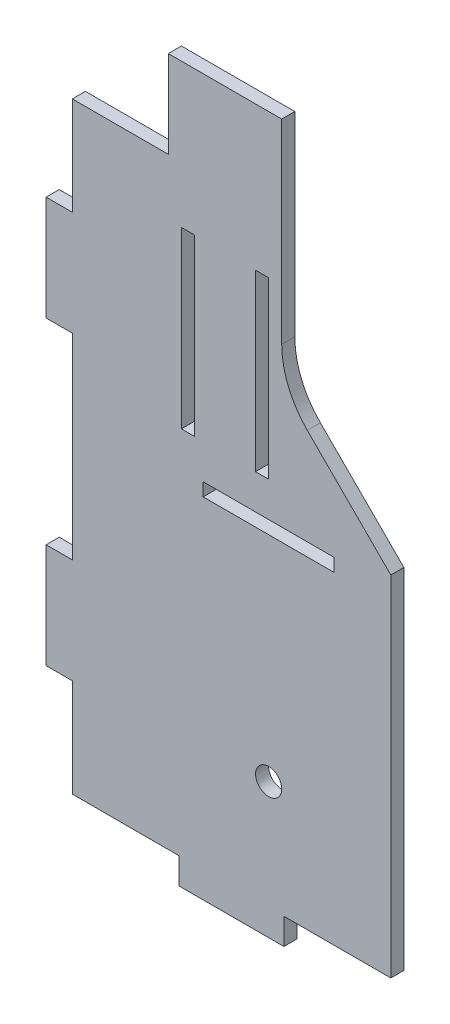
ISO-10303-21;
HEADER;
FILE_DESCRIPTION(('STEP AP214'),'2;1');
FILE_NAME('part.step','',(''),(''),'','','');
FILE_SCHEMA(('AUTOMOTIVE_DESIGN { 1 0 10303 214 1 1 1 1 }'));
ENDSEC;
DATA;
#1=APPLICATION_CONTEXT('core data for automotive mechanical design processes');
#2=APPLICATION_PROTOCOL_DEFINITION('international standard','automotive_design',2000,#1);
#3=PRODUCT_CONTEXT('',#1,'mechanical');
#4=PRODUCT('Part','Part','',(#3));
#5=PRODUCT_RELATED_PRODUCT_CATEGORY('part','',(#4));
#6=PRODUCT_DEFINITION_FORMATION('','',#4);
#7=PRODUCT_DEFINITION_CONTEXT('part definition',#1,'design');
#8=PRODUCT_DEFINITION('design','',#6,#7);
#9=PRODUCT_DEFINITION_SHAPE('','',#8);
#10=(LENGTH_UNIT() NAMED_UNIT(*) SI_UNIT(.MILLI.,.METRE.));
#11=(NAMED_UNIT(*) PLANE_ANGLE_UNIT() SI_UNIT($,.RADIAN.));
#12=(NAMED_UNIT(*) SI_UNIT($,.STERADIAN.) SOLID_ANGLE_UNIT());
#13=UNCERTAINTY_MEASURE_WITH_UNIT(LENGTH_MEASURE(1.E-05),#10,'distance_accuracy_value','');
#14=(GEOMETRIC_REPRESENTATION_CONTEXT(3) GLOBAL_UNCERTAINTY_ASSIGNED_CONTEXT((#13)) GLOBAL_UNIT_ASSIGNED_CONTEXT((#10,
#11,#12)) REPRESENTATION_CONTEXT('',''));
#15=CARTESIAN_POINT('',(0.,0.,0.));
#16=DIRECTION('',(0.,0.,1.));
#17=DIRECTION('',(1.,0.,0.));
#18=AXIS2_PLACEMENT_3D('',#15,#16,#17);
#19=CARTESIAN_POINT('',(-31.,138.,3.));
#20=DIRECTION('',(0.,-1.,0.));
#21=DIRECTION('',(0.,0.,-1.));
#22=AXIS2_PLACEMENT_3D('',#19,#20,#21);
#23=PLANE('',#22);
#24=DIRECTION('',(0.,0.,1.));
#25=VECTOR('',#24,1.);
#26=CARTESIAN_POINT('',(-51.,138.,0.));
#27=LINE('',#26,#25);
#28=CARTESIAN_POINT('',(-51.,138.,0.));
#29=VERTEX_POINT('',#28);
#30=CARTESIAN_POINT('',(-51.,138.,3.));
#31=VERTEX_POINT('',#30);
#32=EDGE_CURVE('E50',#29,#31,#27,.T.);
#33=ORIENTED_EDGE('',*,*,#32,.F.);
#34=DIRECTION('',(-1.,0.,0.));
#35=VECTOR('',#34,1.);
#36=CARTESIAN_POINT('',(-31.,138.,0.));
#37=LINE('',#36,#35);
#38=CARTESIAN_POINT('',(-73.,138.,0.));
#39=VERTEX_POINT('',#38);
#40=EDGE_CURVE('E463',#29,#39,#37,.T.);
#41=ORIENTED_EDGE('',*,*,#40,.T.);
#42=DIRECTION('',(0.,0.,-1.));
#43=VECTOR('',#42,1.);
#44=CARTESIAN_POINT('',(-73.,138.,3.));
#45=LINE('',#44,#43);
#46=CARTESIAN_POINT('',(-73.,138.,3.));
#47=VERTEX_POINT('',#46);
#48=EDGE_CURVE('E497',#47,#39,#45,.T.);
#49=ORIENTED_EDGE('',*,*,#48,.F.);
#50=DIRECTION('',(-1.,0.,0.));
#51=VECTOR('',#50,1.);
#52=CARTESIAN_POINT('',(-31.,138.,3.));
#53=LINE('',#52,#51);
#54=EDGE_CURVE('E466',#31,#47,#53,.T.);
#55=ORIENTED_EDGE('',*,*,#54,.F.);
#56=EDGE_LOOP('',(#33,#41,#49,#55));
#57=FACE_BOUND('',#56,.T.);
#58=ADVANCED_FACE('F35',(#57),#23,.F.);
#59=CARTESIAN_POINT('',(-73.,0.,3.));
#60=DIRECTION('',(0.,1.,0.));
#61=DIRECTION('',(-1.,0.,0.));
#62=AXIS2_PLACEMENT_3D('',#59,#60,#61);
#63=PLANE('',#62);
#64=DIRECTION('',(0.,0.,1.));
#65=VECTOR('',#64,1.);
#66=CARTESIAN_POINT('',(-24.5,0.,-68.425141578224));
#67=LINE('',#66,#65);
#68=CARTESIAN_POINT('',(-24.5,0.,0.));
#69=VERTEX_POINT('',#68);
#70=CARTESIAN_POINT('',(-24.5,0.,3.));
#71=VERTEX_POINT('',#70);
#72=EDGE_CURVE('E399',#69,#71,#67,.T.);
#73=ORIENTED_EDGE('',*,*,#72,.F.);
#74=DIRECTION('',(1.,0.,0.));
#75=VECTOR('',#74,1.);
#76=CARTESIAN_POINT('',(-73.,0.,0.));
#77=LINE('',#76,#75);
#78=CARTESIAN_POINT('',(0.,0.,0.));
#79=VERTEX_POINT('',#78);
#80=EDGE_CURVE('E486',#69,#79,#77,.T.);
#81=ORIENTED_EDGE('',*,*,#80,.T.);
#82=DIRECTION('',(0.,0.,-1.));
#83=VECTOR('',#82,1.);
#84=CARTESIAN_POINT('',(0.,0.,3.));
#85=LINE('',#84,#83);
#86=CARTESIAN_POINT('',(0.,0.,3.));
#87=VERTEX_POINT('',#86);
#88=EDGE_CURVE('E481',#87,#79,#85,.T.);
#89=ORIENTED_EDGE('',*,*,#88,.F.);
#90=DIRECTION('',(1.,0.,0.));
#91=VECTOR('',#90,1.);
#92=CARTESIAN_POINT('',(-73.,0.,3.));
#93=LINE('',#92,#91);
#94=EDGE_CURVE('E473',#71,#87,#93,.T.);
#95=ORIENTED_EDGE('',*,*,#94,.F.);
#96=EDGE_LOOP('',(#73,#81,#89,#95));
#97=FACE_BOUND('',#96,.T.);
#98=ADVANCED_FACE('F592',(#97),#63,.F.);
#99=CARTESIAN_POINT('',(-73.,138.,3.));
#100=DIRECTION('',(1.,0.,0.));
#101=DIRECTION('',(0.,1.,0.));
#102=AXIS2_PLACEMENT_3D('',#99,#100,#101);
#103=PLANE('',#102);
#104=DIRECTION('',(0.,-1.,0.));
#105=VECTOR('',#104,1.);
#106=CARTESIAN_POINT('',(-73.,138.,3.));
#107=LINE('',#106,#105);
#108=CARTESIAN_POINT('',(-73.,22.5,3.));
#109=VERTEX_POINT('',#108);
#110=CARTESIAN_POINT('',(-73.,0.,3.));
#111=VERTEX_POINT('',#110);
#112=EDGE_CURVE('E468',#109,#111,#107,.T.);
#113=ORIENTED_EDGE('',*,*,#112,.F.);
#114=DIRECTION('',(0.,0.,1.));
#115=VECTOR('',#114,1.);
#116=CARTESIAN_POINT('',(-73.,22.5,-68.425141578224));
#117=LINE('',#116,#115);
#118=CARTESIAN_POINT('',(-73.,22.5,0.));
#119=VERTEX_POINT('',#118);
#120=EDGE_CURVE('E410',#119,#109,#117,.T.);
#121=ORIENTED_EDGE('',*,*,#120,.F.);
#122=DIRECTION('',(0.,-1.,0.));
#123=VECTOR('',#122,1.);
#124=CARTESIAN_POINT('',(-73.,138.,0.));
#125=LINE('',#124,#123);
#126=CARTESIAN_POINT('',(-73.,0.,0.));
#127=VERTEX_POINT('',#126);
#128=EDGE_CURVE('E483',#119,#127,#125,.T.);
#129=ORIENTED_EDGE('',*,*,#128,.T.);
#130=DIRECTION('',(0.,0.,-1.));
#131=VECTOR('',#130,1.);
#132=CARTESIAN_POINT('',(-73.,0.,3.));
#133=LINE('',#132,#131);
#134=EDGE_CURVE('E494',#111,#127,#133,.T.);
#135=ORIENTED_EDGE('',*,*,#134,.F.);
#136=EDGE_LOOP('',(#113,#121,#129,#135));
#137=FACE_BOUND('',#136,.T.);
#138=ADVANCED_FACE('F541',(#137),#103,.F.);
#139=CARTESIAN_POINT('',(-73.,91.5,0.));
#140=VERTEX_POINT('',#139);
#141=CARTESIAN_POINT('',(-73.,46.5,0.));
#142=VERTEX_POINT('',#141);
#143=EDGE_CURVE('E487',#140,#142,#125,.T.);
#144=ORIENTED_EDGE('',*,*,#143,.T.);
#145=DIRECTION('',(0.,0.,1.));
#146=VECTOR('',#145,1.);
#147=CARTESIAN_POINT('',(-73.,46.5,-68.425141578224));
#148=LINE('',#147,#146);
#149=CARTESIAN_POINT('',(-73.,46.5,3.));
#150=VERTEX_POINT('',#149);
#151=EDGE_CURVE('E421',#142,#150,#148,.T.);
#152=ORIENTED_EDGE('',*,*,#151,.T.);
#153=CARTESIAN_POINT('',(-73.,91.5,3.));
#154=VERTEX_POINT('',#153);
#155=EDGE_CURVE('E474',#154,#150,#107,.T.);
#156=ORIENTED_EDGE('',*,*,#155,.F.);
#157=DIRECTION('',(0.,0.,1.));
#158=VECTOR('',#157,1.);
#159=CARTESIAN_POINT('',(-73.,91.5,-68.425141578224));
#160=LINE('',#159,#158);
#161=EDGE_CURVE('E435',#140,#154,#160,.T.);
#162=ORIENTED_EDGE('',*,*,#161,.F.);
#163=EDGE_LOOP('',(#144,#152,#156,#162));
#164=FACE_BOUND('',#163,.T.);
#165=ADVANCED_FACE('F686',(#164),#103,.F.);
#166=CARTESIAN_POINT('',(-73.,115.5,0.));
#167=VERTEX_POINT('',#166);
#168=EDGE_CURVE('E484',#39,#167,#125,.T.);
#169=ORIENTED_EDGE('',*,*,#168,.T.);
#170=DIRECTION('',(0.,0.,1.));
#171=VECTOR('',#170,1.);
#172=CARTESIAN_POINT('',(-73.,115.5,-68.425141578224));
#173=LINE('',#172,#171);
#174=CARTESIAN_POINT('',(-73.,115.5,3.));
#175=VERTEX_POINT('',#174);
#176=EDGE_CURVE('E446',#167,#175,#173,.T.);
#177=ORIENTED_EDGE('',*,*,#176,.T.);
#178=EDGE_CURVE('E470',#47,#175,#107,.T.);
#179=ORIENTED_EDGE('',*,*,#178,.F.);
#180=ORIENTED_EDGE('',*,*,#48,.T.);
#181=EDGE_LOOP('',(#169,#177,#179,#180));
#182=FACE_BOUND('',#181,.T.);
#183=ADVANCED_FACE('F578',(#182),#103,.F.);
#184=CARTESIAN_POINT('',(-48.5,0.,0.));
#185=VERTEX_POINT('',#184);
#186=EDGE_CURVE('E488',#127,#185,#77,.T.);
#187=ORIENTED_EDGE('',*,*,#186,.T.);
#188=DIRECTION('',(0.,0.,1.));
#189=VECTOR('',#188,1.);
#190=CARTESIAN_POINT('',(-48.5,0.,-68.425141578224));
#191=LINE('',#190,#189);
#192=CARTESIAN_POINT('',(-48.5,0.,3.));
#193=VERTEX_POINT('',#192);
#194=EDGE_CURVE('E385',#185,#193,#191,.T.);
#195=ORIENTED_EDGE('',*,*,#194,.T.);
#196=EDGE_CURVE('E475',#111,#193,#93,.T.);
#197=ORIENTED_EDGE('',*,*,#196,.F.);
#198=ORIENTED_EDGE('',*,*,#134,.T.);
#199=EDGE_LOOP('',(#187,#195,#197,#198));
#200=FACE_BOUND('',#199,.T.);
#201=ADVANCED_FACE('F536',(#200),#63,.F.);
#202=CARTESIAN_POINT('',(0.,0.,3.));
#203=DIRECTION('',(-1.,0.,0.));
#204=DIRECTION('',(0.,-1.,0.));
#205=AXIS2_PLACEMENT_3D('',#202,#203,#204);
#206=PLANE('',#205);
#207=DIRECTION('',(0.,1.,0.));
#208=VECTOR('',#207,1.);
#209=CARTESIAN_POINT('',(0.,0.,0.));
#210=LINE('',#209,#208);
#211=CARTESIAN_POINT('',(0.,80.,0.));
#212=VERTEX_POINT('',#211);
#213=EDGE_CURVE('E469',#79,#212,#210,.T.);
#214=ORIENTED_EDGE('',*,*,#213,.T.);
#215=DIRECTION('',(0.,0.,1.));
#216=VECTOR('',#215,1.);
#217=CARTESIAN_POINT('',(0.,80.,-68.425141578224));
#218=LINE('',#217,#216);
#219=CARTESIAN_POINT('',(0.,80.,3.));
#220=VERTEX_POINT('',#219);
#221=EDGE_CURVE('E261',#212,#220,#218,.T.);
#222=ORIENTED_EDGE('',*,*,#221,.T.);
#223=DIRECTION('',(0.,1.,0.));
#224=VECTOR('',#223,1.);
#225=CARTESIAN_POINT('',(0.,0.,3.));
#226=LINE('',#225,#224);
#227=EDGE_CURVE('E478',#87,#220,#226,.T.);
#228=ORIENTED_EDGE('',*,*,#227,.F.);
#229=ORIENTED_EDGE('',*,*,#88,.T.);
#230=EDGE_LOOP('',(#214,#222,#228,#229));
#231=FACE_BOUND('',#230,.T.);
#232=ADVANCED_FACE('F515',(#231),#206,.F.);
#233=CARTESIAN_POINT('',(0.,0.,3.));
#234=DIRECTION('',(0.,0.,1.));
#235=DIRECTION('',(1.,0.,0.));
#236=AXIS2_PLACEMENT_3D('',#233,#234,#235);
#237=PLANE('',#236);
#238=DIRECTION('',(0.,-1.,0.));
#239=VECTOR('',#238,1.);
#240=CARTESIAN_POINT('',(-43.,77.,3.));
#241=LINE('',#240,#239);
#242=CARTESIAN_POINT('',(-43.,77.,3.));
#243=VERTEX_POINT('',#242);
#244=CARTESIAN_POINT('',(-43.,74.,3.));
#245=VERTEX_POINT('',#244);
#246=EDGE_CURVE('E300',#243,#245,#241,.T.);
#247=ORIENTED_EDGE('',*,*,#246,.F.);
#248=DIRECTION('',(-1.,0.,0.));
#249=VECTOR('',#248,1.);
#250=CARTESIAN_POINT('',(-43.,77.,3.));
#251=LINE('',#250,#249);
#252=CARTESIAN_POINT('',(-13.,77.,3.));
#253=VERTEX_POINT('',#252);
#254=EDGE_CURVE('E290',#253,#243,#251,.T.);
#255=ORIENTED_EDGE('',*,*,#254,.F.);
#256=DIRECTION('',(0.,1.,0.));
#257=VECTOR('',#256,1.);
#258=CARTESIAN_POINT('',(-13.,77.,3.));
#259=LINE('',#258,#257);
#260=CARTESIAN_POINT('',(-13.,74.,3.));
#261=VERTEX_POINT('',#260);
#262=EDGE_CURVE('E306',#261,#253,#259,.T.);
#263=ORIENTED_EDGE('',*,*,#262,.F.);
#264=DIRECTION('',(1.,0.,0.));
#265=VECTOR('',#264,1.);
#266=CARTESIAN_POINT('',(-43.,74.,3.));
#267=LINE('',#266,#265);
#268=EDGE_CURVE('E302',#245,#261,#267,.T.);
#269=ORIENTED_EDGE('',*,*,#268,.F.);
#270=EDGE_LOOP('',(#247,#255,#263,#269));
#271=FACE_BOUND('',#270,.T.);
#272=DIRECTION('',(0.,-1.,0.));
#273=VECTOR('',#272,1.);
#274=CARTESIAN_POINT('',(-48.,125.,3.));
#275=LINE('',#274,#273);
#276=CARTESIAN_POINT('',(-48.,125.,3.));
#277=VERTEX_POINT('',#276);
#278=CARTESIAN_POINT('',(-48.,85.,3.));
#279=VERTEX_POINT('',#278);
#280=EDGE_CURVE('E334',#277,#279,#275,.T.);
#281=ORIENTED_EDGE('',*,*,#280,.F.);
#282=DIRECTION('',(-1.,0.,0.));
#283=VECTOR('',#282,1.);
#284=CARTESIAN_POINT('',(-48.,125.,3.));
#285=LINE('',#284,#283);
#286=CARTESIAN_POINT('',(-45.,125.,3.));
#287=VERTEX_POINT('',#286);
#288=EDGE_CURVE('E324',#287,#277,#285,.T.);
#289=ORIENTED_EDGE('',*,*,#288,.F.);
#290=DIRECTION('',(0.,1.,0.));
#291=VECTOR('',#290,1.);
#292=CARTESIAN_POINT('',(-45.,125.,3.));
#293=LINE('',#292,#291);
#294=CARTESIAN_POINT('',(-45.,85.,3.));
#295=VERTEX_POINT('',#294);
#296=EDGE_CURVE('E340',#295,#287,#293,.T.);
#297=ORIENTED_EDGE('',*,*,#296,.F.);
#298=DIRECTION('',(1.,0.,0.));
#299=VECTOR('',#298,1.);
#300=CARTESIAN_POINT('',(-48.,85.,3.));
#301=LINE('',#300,#299);
#302=EDGE_CURVE('E336',#279,#295,#301,.T.);
#303=ORIENTED_EDGE('',*,*,#302,.F.);
#304=EDGE_LOOP('',(#281,#289,#297,#303));
#305=FACE_BOUND('',#304,.T.);
#306=DIRECTION('',(0.,-1.,0.));
#307=VECTOR('',#306,1.);
#308=CARTESIAN_POINT('',(-31.,125.,3.));
#309=LINE('',#308,#307);
#310=CARTESIAN_POINT('',(-31.,125.,3.));
#311=VERTEX_POINT('',#310);
#312=CARTESIAN_POINT('',(-31.,85.,3.));
#313=VERTEX_POINT('',#312);
#314=EDGE_CURVE('E285',#311,#313,#309,.T.);
#315=ORIENTED_EDGE('',*,*,#314,.F.);
#316=DIRECTION('',(-1.,0.,0.));
#317=VECTOR('',#316,1.);
#318=CARTESIAN_POINT('',(-31.,125.,3.));
#319=LINE('',#318,#317);
#320=CARTESIAN_POINT('',(-28.,125.,3.));
#321=VERTEX_POINT('',#320);
#322=EDGE_CURVE('E356',#321,#311,#319,.T.);
#323=ORIENTED_EDGE('',*,*,#322,.F.);
#324=DIRECTION('',(0.,1.,0.));
#325=VECTOR('',#324,1.);
#326=CARTESIAN_POINT('',(-28.,125.,3.));
#327=LINE('',#326,#325);
#328=CARTESIAN_POINT('',(-28.,85.,3.));
#329=VERTEX_POINT('',#328);
#330=EDGE_CURVE('E370',#329,#321,#327,.T.);
#331=ORIENTED_EDGE('',*,*,#330,.F.);
#332=DIRECTION('',(1.,0.,0.));
#333=VECTOR('',#332,1.);
#334=CARTESIAN_POINT('',(-31.,85.,3.));
#335=LINE('',#334,#333);
#336=EDGE_CURVE('E367',#313,#329,#335,.T.);
#337=ORIENTED_EDGE('',*,*,#336,.F.);
#338=EDGE_LOOP('',(#315,#323,#331,#337));
#339=FACE_BOUND('',#338,.T.);
#340=CARTESIAN_POINT('',(-28.,25.,3.));
#341=DIRECTION('',(0.,0.,1.));
#342=DIRECTION('',(1.,0.,0.));
#343=AXIS2_PLACEMENT_3D('',#340,#341,#342);
#344=CIRCLE('',#343,2.99999999999999);
#345=CARTESIAN_POINT('',(-25.,25.,3.));
#346=VERTEX_POINT('',#345);
#347=EDGE_CURVE('E260',#346,#346,#344,.T.);
#348=ORIENTED_EDGE('',*,*,#347,.F.);
#349=EDGE_LOOP('',(#348));
#350=FACE_BOUND('',#349,.T.);
#351=DIRECTION('',(0.,1.,0.));
#352=VECTOR('',#351,1.);
#353=CARTESIAN_POINT('',(-25.,138.,3.));
#354=LINE('',#353,#352);
#355=CARTESIAN_POINT('',(-25.,113.284271247462,3.));
#356=VERTEX_POINT('',#355);
#357=CARTESIAN_POINT('',(-25.,158.,3.));
#358=VERTEX_POINT('',#357);
#359=EDGE_CURVE('E455',#356,#358,#354,.T.);
#360=ORIENTED_EDGE('',*,*,#359,.T.);
#361=DIRECTION('',(1.,0.,0.));
#362=VECTOR('',#361,1.);
#363=CARTESIAN_POINT('',(-25.,158.,3.));
#364=LINE('',#363,#362);
#365=CARTESIAN_POINT('',(-51.,158.,3.));
#366=VERTEX_POINT('',#365);
#367=EDGE_CURVE('E275',#366,#358,#364,.T.);
#368=ORIENTED_EDGE('',*,*,#367,.F.);
#369=DIRECTION('',(0.,-1.,0.));
#370=VECTOR('',#369,1.);
#371=CARTESIAN_POINT('',(-51.,158.,3.));
#372=LINE('',#371,#370);
#373=EDGE_CURVE('E280',#366,#31,#372,.T.);
#374=ORIENTED_EDGE('',*,*,#373,.T.);
#375=ORIENTED_EDGE('',*,*,#54,.T.);
#376=ORIENTED_EDGE('',*,*,#178,.T.);
#377=DIRECTION('',(-1.,0.,0.));
#378=VECTOR('',#377,1.);
#379=CARTESIAN_POINT('',(-73.,115.5,3.));
#380=LINE('',#379,#378);
#381=CARTESIAN_POINT('',(-79.,115.5,3.));
#382=VERTEX_POINT('',#381);
#383=EDGE_CURVE('E431',#175,#382,#380,.T.);
#384=ORIENTED_EDGE('',*,*,#383,.T.);
#385=DIRECTION('',(0.,-1.,0.));
#386=VECTOR('',#385,1.);
#387=CARTESIAN_POINT('',(-79.,115.5,3.));
#388=LINE('',#387,#386);
#389=CARTESIAN_POINT('',(-79.,91.5,3.));
#390=VERTEX_POINT('',#389);
#391=EDGE_CURVE('E440',#382,#390,#388,.T.);
#392=ORIENTED_EDGE('',*,*,#391,.T.);
#393=DIRECTION('',(1.,0.,0.));
#394=VECTOR('',#393,1.);
#395=CARTESIAN_POINT('',(-73.,91.5,3.));
#396=LINE('',#395,#394);
#397=EDGE_CURVE('E443',#390,#154,#396,.T.);
#398=ORIENTED_EDGE('',*,*,#397,.T.);
#399=ORIENTED_EDGE('',*,*,#155,.T.);
#400=DIRECTION('',(-1.,0.,0.));
#401=VECTOR('',#400,1.);
#402=CARTESIAN_POINT('',(-73.,46.5,3.));
#403=LINE('',#402,#401);
#404=CARTESIAN_POINT('',(-79.,46.5,3.));
#405=VERTEX_POINT('',#404);
#406=EDGE_CURVE('E406',#150,#405,#403,.T.);
#407=ORIENTED_EDGE('',*,*,#406,.T.);
#408=DIRECTION('',(0.,-1.,0.));
#409=VECTOR('',#408,1.);
#410=CARTESIAN_POINT('',(-79.,46.5,3.));
#411=LINE('',#410,#409);
#412=CARTESIAN_POINT('',(-79.,22.5,3.));
#413=VERTEX_POINT('',#412);
#414=EDGE_CURVE('E415',#405,#413,#411,.T.);
#415=ORIENTED_EDGE('',*,*,#414,.T.);
#416=DIRECTION('',(1.,0.,0.));
#417=VECTOR('',#416,1.);
#418=CARTESIAN_POINT('',(-73.,22.5,3.));
#419=LINE('',#418,#417);
#420=EDGE_CURVE('E418',#413,#109,#419,.T.);
#421=ORIENTED_EDGE('',*,*,#420,.T.);
#422=ORIENTED_EDGE('',*,*,#112,.T.);
#423=ORIENTED_EDGE('',*,*,#196,.T.);
#424=DIRECTION('',(0.,-1.,0.));
#425=VECTOR('',#424,1.);
#426=CARTESIAN_POINT('',(-48.5,0.,3.));
#427=LINE('',#426,#425);
#428=CARTESIAN_POINT('',(-48.5,-6.00000000000003,3.));
#429=VERTEX_POINT('',#428);
#430=EDGE_CURVE('E313',#193,#429,#427,.T.);
#431=ORIENTED_EDGE('',*,*,#430,.T.);
#432=DIRECTION('',(1.,0.,0.));
#433=VECTOR('',#432,1.);
#434=CARTESIAN_POINT('',(-48.5,-6.00000000000003,3.));
#435=LINE('',#434,#433);
#436=CARTESIAN_POINT('',(-24.5,-6.00000000000003,3.));
#437=VERTEX_POINT('',#436);
#438=EDGE_CURVE('E391',#429,#437,#435,.T.);
#439=ORIENTED_EDGE('',*,*,#438,.T.);
#440=DIRECTION('',(0.,1.,0.));
#441=VECTOR('',#440,1.);
#442=CARTESIAN_POINT('',(-24.5,0.,3.));
#443=LINE('',#442,#441);
#444=EDGE_CURVE('E394',#437,#71,#443,.T.);
#445=ORIENTED_EDGE('',*,*,#444,.T.);
#446=ORIENTED_EDGE('',*,*,#94,.T.);
#447=ORIENTED_EDGE('',*,*,#227,.T.);
#448=DIRECTION('',(0.707106781186551,-0.707106781186544,0.));
#449=VECTOR('',#448,1.);
#450=CARTESIAN_POINT('',(1.70002900645727E-13,80.,3.));
#451=LINE('',#450,#449);
#452=CARTESIAN_POINT('',(-19.1421356237309,99.1421356237309,3.));
#453=VERTEX_POINT('',#452);
#454=EDGE_CURVE('E500',#220,#453,#451,.F.);
#455=ORIENTED_EDGE('',*,*,#454,.T.);
#456=CARTESIAN_POINT('',(-5.00000000000002,113.284271247462,3.));
#457=DIRECTION('',(0.,0.,1.));
#458=DIRECTION('',(1.,0.,0.));
#459=AXIS2_PLACEMENT_3D('',#456,#457,#458);
#460=CIRCLE('',#459,20.);
#461=EDGE_CURVE('E11',#453,#356,#460,.F.);
#462=ORIENTED_EDGE('',*,*,#461,.T.);
#463=EDGE_LOOP('',(#360,#368,#374,#375,#376,#384,#392,#398,#399,#407,#415,#421,#422,#423,#431,
#439,#445,#446,#447,#455,#462));
#464=FACE_BOUND('',#463,.T.);
#465=ADVANCED_FACE('F511',(#271,#305,#339,#350,#464),#237,.T.);
#466=CARTESIAN_POINT('',(0.,0.,0.));
#467=DIRECTION('',(0.,0.,1.));
#468=DIRECTION('',(1.,0.,0.));
#469=AXIS2_PLACEMENT_3D('',#466,#467,#468);
#470=PLANE('',#469);
#471=DIRECTION('',(-1.,0.,0.));
#472=VECTOR('',#471,1.);
#473=CARTESIAN_POINT('',(-43.,77.,0.));
#474=LINE('',#473,#472);
#475=CARTESIAN_POINT('',(-13.,77.,0.));
#476=VERTEX_POINT('',#475);
#477=CARTESIAN_POINT('',(-43.,77.,0.));
#478=VERTEX_POINT('',#477);
#479=EDGE_CURVE('E296',#476,#478,#474,.T.);
#480=ORIENTED_EDGE('',*,*,#479,.T.);
#481=DIRECTION('',(0.,-1.,0.));
#482=VECTOR('',#481,1.);
#483=CARTESIAN_POINT('',(-43.,77.,0.));
#484=LINE('',#483,#482);
#485=CARTESIAN_POINT('',(-43.,74.,0.));
#486=VERTEX_POINT('',#485);
#487=EDGE_CURVE('E286',#478,#486,#484,.T.);
#488=ORIENTED_EDGE('',*,*,#487,.T.);
#489=DIRECTION('',(1.,0.,0.));
#490=VECTOR('',#489,1.);
#491=CARTESIAN_POINT('',(-43.,74.,0.));
#492=LINE('',#491,#490);
#493=CARTESIAN_POINT('',(-13.,74.,0.));
#494=VERTEX_POINT('',#493);
#495=EDGE_CURVE('E289',#486,#494,#492,.T.);
#496=ORIENTED_EDGE('',*,*,#495,.T.);
#497=DIRECTION('',(0.,1.,0.));
#498=VECTOR('',#497,1.);
#499=CARTESIAN_POINT('',(-13.,77.,0.));
#500=LINE('',#499,#498);
#501=EDGE_CURVE('E293',#494,#476,#500,.T.);
#502=ORIENTED_EDGE('',*,*,#501,.T.);
#503=EDGE_LOOP('',(#480,#488,#496,#502));
#504=FACE_BOUND('',#503,.T.);
#505=DIRECTION('',(-1.,0.,0.));
#506=VECTOR('',#505,1.);
#507=CARTESIAN_POINT('',(-48.,125.,0.));
#508=LINE('',#507,#506);
#509=CARTESIAN_POINT('',(-45.,125.,0.));
#510=VERTEX_POINT('',#509);
#511=CARTESIAN_POINT('',(-48.,125.,0.));
#512=VERTEX_POINT('',#511);
#513=EDGE_CURVE('E330',#510,#512,#508,.T.);
#514=ORIENTED_EDGE('',*,*,#513,.T.);
#515=DIRECTION('',(0.,-1.,0.));
#516=VECTOR('',#515,1.);
#517=CARTESIAN_POINT('',(-48.,125.,0.));
#518=LINE('',#517,#516);
#519=CARTESIAN_POINT('',(-48.,85.,0.));
#520=VERTEX_POINT('',#519);
#521=EDGE_CURVE('E320',#512,#520,#518,.T.);
#522=ORIENTED_EDGE('',*,*,#521,.T.);
#523=DIRECTION('',(1.,0.,0.));
#524=VECTOR('',#523,1.);
#525=CARTESIAN_POINT('',(-48.,85.,0.));
#526=LINE('',#525,#524);
#527=CARTESIAN_POINT('',(-45.,85.,0.));
#528=VERTEX_POINT('',#527);
#529=EDGE_CURVE('E323',#520,#528,#526,.T.);
#530=ORIENTED_EDGE('',*,*,#529,.T.);
#531=DIRECTION('',(0.,1.,0.));
#532=VECTOR('',#531,1.);
#533=CARTESIAN_POINT('',(-45.,125.,0.));
#534=LINE('',#533,#532);
#535=EDGE_CURVE('E327',#528,#510,#534,.T.);
#536=ORIENTED_EDGE('',*,*,#535,.T.);
#537=EDGE_LOOP('',(#514,#522,#530,#536));
#538=FACE_BOUND('',#537,.T.);
#539=DIRECTION('',(-1.,0.,0.));
#540=VECTOR('',#539,1.);
#541=CARTESIAN_POINT('',(-31.,125.,0.));
#542=LINE('',#541,#540);
#543=CARTESIAN_POINT('',(-28.,125.,0.));
#544=VERTEX_POINT('',#543);
#545=CARTESIAN_POINT('',(-31.,125.,0.));
#546=VERTEX_POINT('',#545);
#547=EDGE_CURVE('E362',#544,#546,#542,.T.);
#548=ORIENTED_EDGE('',*,*,#547,.T.);
#549=DIRECTION('',(0.,-1.,0.));
#550=VECTOR('',#549,1.);
#551=CARTESIAN_POINT('',(-31.,125.,0.));
#552=LINE('',#551,#550);
#553=CARTESIAN_POINT('',(-31.,85.,0.));
#554=VERTEX_POINT('',#553);
#555=EDGE_CURVE('E352',#546,#554,#552,.T.);
#556=ORIENTED_EDGE('',*,*,#555,.T.);
#557=DIRECTION('',(1.,0.,0.));
#558=VECTOR('',#557,1.);
#559=CARTESIAN_POINT('',(-31.,85.,0.));
#560=LINE('',#559,#558);
#561=CARTESIAN_POINT('',(-28.,85.,0.));
#562=VERTEX_POINT('',#561);
#563=EDGE_CURVE('E355',#554,#562,#560,.T.);
#564=ORIENTED_EDGE('',*,*,#563,.T.);
#565=DIRECTION('',(0.,1.,0.));
#566=VECTOR('',#565,1.);
#567=CARTESIAN_POINT('',(-28.,125.,0.));
#568=LINE('',#567,#566);
#569=EDGE_CURVE('E359',#562,#544,#568,.T.);
#570=ORIENTED_EDGE('',*,*,#569,.T.);
#571=EDGE_LOOP('',(#548,#556,#564,#570));
#572=FACE_BOUND('',#571,.T.);
#573=CARTESIAN_POINT('',(-28.,25.,0.));
#574=DIRECTION('',(0.,0.,1.));
#575=DIRECTION('',(1.,0.,0.));
#576=AXIS2_PLACEMENT_3D('',#573,#574,#575);
#577=CIRCLE('',#576,2.99999999999999);
#578=CARTESIAN_POINT('',(-25.,25.,0.));
#579=VERTEX_POINT('',#578);
#580=EDGE_CURVE('E460',#579,#579,#577,.T.);
#581=ORIENTED_EDGE('',*,*,#580,.T.);
#582=EDGE_LOOP('',(#581));
#583=FACE_BOUND('',#582,.T.);
#584=ORIENTED_EDGE('',*,*,#40,.F.);
#585=DIRECTION('',(0.,-1.,0.));
#586=VECTOR('',#585,1.);
#587=CARTESIAN_POINT('',(-51.,158.,0.));
#588=LINE('',#587,#586);
#589=CARTESIAN_POINT('',(-51.,158.,0.));
#590=VERTEX_POINT('',#589);
#591=EDGE_CURVE('E267',#590,#29,#588,.T.);
#592=ORIENTED_EDGE('',*,*,#591,.F.);
#593=DIRECTION('',(-1.,0.,0.));
#594=VECTOR('',#593,1.);
#595=CARTESIAN_POINT('',(-25.,158.,0.));
#596=LINE('',#595,#594);
#597=CARTESIAN_POINT('',(-25.,158.,0.));
#598=VERTEX_POINT('',#597);
#599=EDGE_CURVE('E264',#598,#590,#596,.T.);
#600=ORIENTED_EDGE('',*,*,#599,.F.);
#601=DIRECTION('',(0.,-1.,0.));
#602=VECTOR('',#601,1.);
#603=CARTESIAN_POINT('',(-25.,138.,0.));
#604=LINE('',#603,#602);
#605=CARTESIAN_POINT('',(-25.,113.284271247462,0.));
#606=VERTEX_POINT('',#605);
#607=EDGE_CURVE('E251',#598,#606,#604,.T.);
#608=ORIENTED_EDGE('',*,*,#607,.T.);
#609=CARTESIAN_POINT('',(-5.00000000000002,113.284271247462,0.));
#610=DIRECTION('',(0.,0.,1.));
#611=DIRECTION('',(1.,0.,0.));
#612=AXIS2_PLACEMENT_3D('',#609,#610,#611);
#613=CIRCLE('',#612,20.);
#614=CARTESIAN_POINT('',(-19.1421356237309,99.1421356237309,0.));
#615=VERTEX_POINT('',#614);
#616=EDGE_CURVE('E43',#606,#615,#613,.T.);
#617=ORIENTED_EDGE('',*,*,#616,.T.);
#618=DIRECTION('',(-0.707106781186551,0.707106781186544,0.));
#619=VECTOR('',#618,1.);
#620=CARTESIAN_POINT('',(40.0000000000001,40.0000000000005,0.));
#621=LINE('',#620,#619);
#622=EDGE_CURVE('E502',#615,#212,#621,.F.);
#623=ORIENTED_EDGE('',*,*,#622,.T.);
#624=ORIENTED_EDGE('',*,*,#213,.F.);
#625=ORIENTED_EDGE('',*,*,#80,.F.);
#626=DIRECTION('',(0.,-1.,0.));
#627=VECTOR('',#626,1.);
#628=CARTESIAN_POINT('',(-24.5,0.,0.));
#629=LINE('',#628,#627);
#630=CARTESIAN_POINT('',(-24.5,-6.00000000000003,0.));
#631=VERTEX_POINT('',#630);
#632=EDGE_CURVE('E382',#69,#631,#629,.T.);
#633=ORIENTED_EDGE('',*,*,#632,.T.);
#634=DIRECTION('',(-1.,0.,0.));
#635=VECTOR('',#634,1.);
#636=CARTESIAN_POINT('',(-48.5,-6.00000000000003,0.));
#637=LINE('',#636,#635);
#638=CARTESIAN_POINT('',(-48.5,-6.00000000000003,0.));
#639=VERTEX_POINT('',#638);
#640=EDGE_CURVE('E388',#631,#639,#637,.T.);
#641=ORIENTED_EDGE('',*,*,#640,.T.);
#642=DIRECTION('',(0.,1.,0.));
#643=VECTOR('',#642,1.);
#644=CARTESIAN_POINT('',(-48.5,0.,0.));
#645=LINE('',#644,#643);
#646=EDGE_CURVE('E384',#639,#185,#645,.T.);
#647=ORIENTED_EDGE('',*,*,#646,.T.);
#648=ORIENTED_EDGE('',*,*,#186,.F.);
#649=ORIENTED_EDGE('',*,*,#128,.F.);
#650=DIRECTION('',(-1.,0.,0.));
#651=VECTOR('',#650,1.);
#652=CARTESIAN_POINT('',(-73.,22.5,0.));
#653=LINE('',#652,#651);
#654=CARTESIAN_POINT('',(-79.,22.5,0.));
#655=VERTEX_POINT('',#654);
#656=EDGE_CURVE('E409',#119,#655,#653,.T.);
#657=ORIENTED_EDGE('',*,*,#656,.T.);
#658=DIRECTION('',(0.,1.,0.));
#659=VECTOR('',#658,1.);
#660=CARTESIAN_POINT('',(-79.,46.5,0.));
#661=LINE('',#660,#659);
#662=CARTESIAN_POINT('',(-79.,46.5,0.));
#663=VERTEX_POINT('',#662);
#664=EDGE_CURVE('E407',#655,#663,#661,.T.);
#665=ORIENTED_EDGE('',*,*,#664,.T.);
#666=DIRECTION('',(1.,0.,0.));
#667=VECTOR('',#666,1.);
#668=CARTESIAN_POINT('',(-73.,46.5,0.));
#669=LINE('',#668,#667);
#670=EDGE_CURVE('E412',#663,#142,#669,.T.);
#671=ORIENTED_EDGE('',*,*,#670,.T.);
#672=ORIENTED_EDGE('',*,*,#143,.F.);
#673=DIRECTION('',(-1.,0.,0.));
#674=VECTOR('',#673,1.);
#675=CARTESIAN_POINT('',(-73.,91.5,0.));
#676=LINE('',#675,#674);
#677=CARTESIAN_POINT('',(-79.,91.5,0.));
#678=VERTEX_POINT('',#677);
#679=EDGE_CURVE('E434',#140,#678,#676,.T.);
#680=ORIENTED_EDGE('',*,*,#679,.T.);
#681=DIRECTION('',(0.,1.,0.));
#682=VECTOR('',#681,1.);
#683=CARTESIAN_POINT('',(-79.,115.5,0.));
#684=LINE('',#683,#682);
#685=CARTESIAN_POINT('',(-79.,115.5,0.));
#686=VERTEX_POINT('',#685);
#687=EDGE_CURVE('E432',#678,#686,#684,.T.);
#688=ORIENTED_EDGE('',*,*,#687,.T.);
#689=DIRECTION('',(1.,0.,0.));
#690=VECTOR('',#689,1.);
#691=CARTESIAN_POINT('',(-73.,115.5,0.));
#692=LINE('',#691,#690);
#693=EDGE_CURVE('E437',#686,#167,#692,.T.);
#694=ORIENTED_EDGE('',*,*,#693,.T.);
#695=ORIENTED_EDGE('',*,*,#168,.F.);
#696=EDGE_LOOP('',(#584,#592,#600,#608,#617,#623,#624,#625,#633,#641,#647,#648,#649,#657,#665,
#671,#672,#680,#688,#694,#695));
#697=FACE_BOUND('',#696,.T.);
#698=ADVANCED_FACE('F265',(#504,#538,#572,#583,#697),#470,.F.);
#699=CARTESIAN_POINT('',(-28.,25.,0.));
#700=DIRECTION('',(0.,0.,1.));
#701=DIRECTION('',(1.,0.,0.));
#702=AXIS2_PLACEMENT_3D('',#699,#700,#701);
#703=CYLINDRICAL_SURFACE('',#702,2.99999999999999);
#704=ORIENTED_EDGE('',*,*,#580,.F.);
#705=EDGE_LOOP('',(#704));
#706=FACE_BOUND('',#705,.T.);
#707=ORIENTED_EDGE('',*,*,#347,.T.);
#708=EDGE_LOOP('',(#707));
#709=FACE_BOUND('',#708,.T.);
#710=ADVANCED_FACE('F671',(#706,#709),#703,.F.);
#711=CARTESIAN_POINT('',(-25.,138.,-68.425141578224));
#712=DIRECTION('',(1.,0.,0.));
#713=DIRECTION('',(0.,1.,0.));
#714=AXIS2_PLACEMENT_3D('',#711,#712,#713);
#715=PLANE('',#714);
#716=ORIENTED_EDGE('',*,*,#359,.F.);
#717=DIRECTION('',(0.,0.,1.));
#718=VECTOR('',#717,1.);
#719=CARTESIAN_POINT('',(-25.,113.284271247462,-68.425141578224));
#720=LINE('',#719,#718);
#721=EDGE_CURVE('E258',#356,#606,#720,.F.);
#722=ORIENTED_EDGE('',*,*,#721,.T.);
#723=ORIENTED_EDGE('',*,*,#607,.F.);
#724=DIRECTION('',(0.,0.,-1.));
#725=VECTOR('',#724,1.);
#726=CARTESIAN_POINT('',(-25.,158.,0.));
#727=LINE('',#726,#725);
#728=EDGE_CURVE('E256',#358,#598,#727,.T.);
#729=ORIENTED_EDGE('',*,*,#728,.F.);
#730=EDGE_LOOP('',(#716,#722,#723,#729));
#731=FACE_BOUND('',#730,.T.);
#732=ADVANCED_FACE('F254',(#731),#715,.T.);
#733=CARTESIAN_POINT('',(-73.,91.5,-68.425141578224));
#734=DIRECTION('',(0.,-1.,0.));
#735=DIRECTION('',(1.,0.,0.));
#736=AXIS2_PLACEMENT_3D('',#733,#734,#735);
#737=PLANE('',#736);
#738=ORIENTED_EDGE('',*,*,#679,.F.);
#739=ORIENTED_EDGE('',*,*,#161,.T.);
#740=ORIENTED_EDGE('',*,*,#397,.F.);
#741=DIRECTION('',(0.,0.,1.));
#742=VECTOR('',#741,1.);
#743=CARTESIAN_POINT('',(-79.,91.5,-68.425141578224));
#744=LINE('',#743,#742);
#745=EDGE_CURVE('E449',#678,#390,#744,.T.);
#746=ORIENTED_EDGE('',*,*,#745,.F.);
#747=EDGE_LOOP('',(#738,#739,#740,#746));
#748=FACE_BOUND('',#747,.T.);
#749=ADVANCED_FACE('F563',(#748),#737,.T.);
#750=CARTESIAN_POINT('',(-79.,115.5,-68.425141578224));
#751=DIRECTION('',(-1.,0.,0.));
#752=DIRECTION('',(0.,0.,1.));
#753=AXIS2_PLACEMENT_3D('',#750,#751,#752);
#754=PLANE('',#753);
#755=ORIENTED_EDGE('',*,*,#687,.F.);
#756=ORIENTED_EDGE('',*,*,#745,.T.);
#757=ORIENTED_EDGE('',*,*,#391,.F.);
#758=DIRECTION('',(0.,0.,1.));
#759=VECTOR('',#758,1.);
#760=CARTESIAN_POINT('',(-79.,115.5,-68.425141578224));
#761=LINE('',#760,#759);
#762=EDGE_CURVE('E451',#686,#382,#761,.T.);
#763=ORIENTED_EDGE('',*,*,#762,.F.);
#764=EDGE_LOOP('',(#755,#756,#757,#763));
#765=FACE_BOUND('',#764,.T.);
#766=ADVANCED_FACE('F567',(#765),#754,.T.);
#767=CARTESIAN_POINT('',(-73.,115.5,-68.425141578224));
#768=DIRECTION('',(0.,1.,0.));
#769=DIRECTION('',(0.,0.,1.));
#770=AXIS2_PLACEMENT_3D('',#767,#768,#769);
#771=PLANE('',#770);
#772=ORIENTED_EDGE('',*,*,#693,.F.);
#773=ORIENTED_EDGE('',*,*,#762,.T.);
#774=ORIENTED_EDGE('',*,*,#383,.F.);
#775=ORIENTED_EDGE('',*,*,#176,.F.);
#776=EDGE_LOOP('',(#772,#773,#774,#775));
#777=FACE_BOUND('',#776,.T.);
#778=ADVANCED_FACE('F574',(#777),#771,.T.);
#779=CARTESIAN_POINT('',(-73.,22.5,-68.425141578224));
#780=DIRECTION('',(0.,-1.,0.));
#781=DIRECTION('',(1.,0.,0.));
#782=AXIS2_PLACEMENT_3D('',#779,#780,#781);
#783=PLANE('',#782);
#784=ORIENTED_EDGE('',*,*,#656,.F.);
#785=ORIENTED_EDGE('',*,*,#120,.T.);
#786=ORIENTED_EDGE('',*,*,#420,.F.);
#787=DIRECTION('',(0.,0.,1.));
#788=VECTOR('',#787,1.);
#789=CARTESIAN_POINT('',(-79.,22.5,-68.425141578224));
#790=LINE('',#789,#788);
#791=EDGE_CURVE('E424',#655,#413,#790,.T.);
#792=ORIENTED_EDGE('',*,*,#791,.F.);
#793=EDGE_LOOP('',(#784,#785,#786,#792));
#794=FACE_BOUND('',#793,.T.);
#795=ADVANCED_FACE('F546',(#794),#783,.T.);
#796=CARTESIAN_POINT('',(-79.,46.5,-68.425141578224));
#797=DIRECTION('',(-1.,0.,0.));
#798=DIRECTION('',(0.,0.,1.));
#799=AXIS2_PLACEMENT_3D('',#796,#797,#798);
#800=PLANE('',#799);
#801=ORIENTED_EDGE('',*,*,#664,.F.);
#802=ORIENTED_EDGE('',*,*,#791,.T.);
#803=ORIENTED_EDGE('',*,*,#414,.F.);
#804=DIRECTION('',(0.,0.,1.));
#805=VECTOR('',#804,1.);
#806=CARTESIAN_POINT('',(-79.,46.5,-68.425141578224));
#807=LINE('',#806,#805);
#808=EDGE_CURVE('E426',#663,#405,#807,.T.);
#809=ORIENTED_EDGE('',*,*,#808,.F.);
#810=EDGE_LOOP('',(#801,#802,#803,#809));
#811=FACE_BOUND('',#810,.T.);
#812=ADVANCED_FACE('F549',(#811),#800,.T.);
#813=CARTESIAN_POINT('',(-73.,46.5,-68.425141578224));
#814=DIRECTION('',(0.,1.,0.));
#815=DIRECTION('',(-1.,0.,0.));
#816=AXIS2_PLACEMENT_3D('',#813,#814,#815);
#817=PLANE('',#816);
#818=ORIENTED_EDGE('',*,*,#670,.F.);
#819=ORIENTED_EDGE('',*,*,#808,.T.);
#820=ORIENTED_EDGE('',*,*,#406,.F.);
#821=ORIENTED_EDGE('',*,*,#151,.F.);
#822=EDGE_LOOP('',(#818,#819,#820,#821));
#823=FACE_BOUND('',#822,.T.);
#824=ADVANCED_FACE('F556',(#823),#817,.T.);
#825=CARTESIAN_POINT('',(-48.5,0.,-68.425141578224));
#826=DIRECTION('',(-1.,0.,0.));
#827=DIRECTION('',(0.,0.,1.));
#828=AXIS2_PLACEMENT_3D('',#825,#826,#827);
#829=PLANE('',#828);
#830=ORIENTED_EDGE('',*,*,#646,.F.);
#831=DIRECTION('',(0.,0.,1.));
#832=VECTOR('',#831,1.);
#833=CARTESIAN_POINT('',(-48.5,-6.00000000000003,-68.425141578224));
#834=LINE('',#833,#832);
#835=EDGE_CURVE('E397',#639,#429,#834,.T.);
#836=ORIENTED_EDGE('',*,*,#835,.T.);
#837=ORIENTED_EDGE('',*,*,#430,.F.);
#838=ORIENTED_EDGE('',*,*,#194,.F.);
#839=EDGE_LOOP('',(#830,#836,#837,#838));
#840=FACE_BOUND('',#839,.T.);
#841=ADVANCED_FACE('F532',(#840),#829,.T.);
#842=CARTESIAN_POINT('',(-24.5,0.,-68.425141578224));
#843=DIRECTION('',(1.,0.,0.));
#844=DIRECTION('',(0.,0.,-1.));
#845=AXIS2_PLACEMENT_3D('',#842,#843,#844);
#846=PLANE('',#845);
#847=ORIENTED_EDGE('',*,*,#632,.F.);
#848=ORIENTED_EDGE('',*,*,#72,.T.);
#849=ORIENTED_EDGE('',*,*,#444,.F.);
#850=DIRECTION('',(0.,0.,1.));
#851=VECTOR('',#850,1.);
#852=CARTESIAN_POINT('',(-24.5,-6.00000000000003,-68.425141578224));
#853=LINE('',#852,#851);
#854=EDGE_CURVE('E402',#631,#437,#853,.T.);
#855=ORIENTED_EDGE('',*,*,#854,.F.);
#856=EDGE_LOOP('',(#847,#848,#849,#855));
#857=FACE_BOUND('',#856,.T.);
#858=ADVANCED_FACE('F521',(#857),#846,.T.);
#859=CARTESIAN_POINT('',(-48.5,-6.00000000000003,-68.425141578224));
#860=DIRECTION('',(0.,-1.,0.));
#861=DIRECTION('',(0.,0.,-1.));
#862=AXIS2_PLACEMENT_3D('',#859,#860,#861);
#863=PLANE('',#862);
#864=ORIENTED_EDGE('',*,*,#640,.F.);
#865=ORIENTED_EDGE('',*,*,#854,.T.);
#866=ORIENTED_EDGE('',*,*,#438,.F.);
#867=ORIENTED_EDGE('',*,*,#835,.F.);
#868=EDGE_LOOP('',(#864,#865,#866,#867));
#869=FACE_BOUND('',#868,.T.);
#870=ADVANCED_FACE('F527',(#869),#863,.T.);
#871=CARTESIAN_POINT('',(-31.,125.,0.));
#872=DIRECTION('',(-1.,0.,0.));
#873=DIRECTION('',(0.,0.,1.));
#874=AXIS2_PLACEMENT_3D('',#871,#872,#873);
#875=PLANE('',#874);
#876=ORIENTED_EDGE('',*,*,#314,.T.);
#877=DIRECTION('',(0.,0.,1.));
#878=VECTOR('',#877,1.);
#879=CARTESIAN_POINT('',(-31.,85.,0.));
#880=LINE('',#879,#878);
#881=EDGE_CURVE('E365',#554,#313,#880,.T.);
#882=ORIENTED_EDGE('',*,*,#881,.F.);
#883=ORIENTED_EDGE('',*,*,#555,.F.);
#884=DIRECTION('',(0.,0.,1.));
#885=VECTOR('',#884,1.);
#886=CARTESIAN_POINT('',(-31.,125.,0.));
#887=LINE('',#886,#885);
#888=EDGE_CURVE('E337',#546,#311,#887,.T.);
#889=ORIENTED_EDGE('',*,*,#888,.T.);
#890=EDGE_LOOP('',(#876,#882,#883,#889));
#891=FACE_BOUND('',#890,.T.);
#892=ADVANCED_FACE('F641',(#891),#875,.F.);
#893=CARTESIAN_POINT('',(-31.,125.,0.));
#894=DIRECTION('',(0.,1.,0.));
#895=DIRECTION('',(0.,0.,1.));
#896=AXIS2_PLACEMENT_3D('',#893,#894,#895);
#897=PLANE('',#896);
#898=ORIENTED_EDGE('',*,*,#322,.T.);
#899=ORIENTED_EDGE('',*,*,#888,.F.);
#900=ORIENTED_EDGE('',*,*,#547,.F.);
#901=DIRECTION('',(0.,0.,1.));
#902=VECTOR('',#901,1.);
#903=CARTESIAN_POINT('',(-28.,125.,0.));
#904=LINE('',#903,#902);
#905=EDGE_CURVE('E376',#544,#321,#904,.T.);
#906=ORIENTED_EDGE('',*,*,#905,.T.);
#907=EDGE_LOOP('',(#898,#899,#900,#906));
#908=FACE_BOUND('',#907,.T.);
#909=ADVANCED_FACE('F637',(#908),#897,.F.);
#910=CARTESIAN_POINT('',(-28.,125.,0.));
#911=DIRECTION('',(1.,0.,0.));
#912=DIRECTION('',(0.,1.,0.));
#913=AXIS2_PLACEMENT_3D('',#910,#911,#912);
#914=PLANE('',#913);
#915=ORIENTED_EDGE('',*,*,#330,.T.);
#916=ORIENTED_EDGE('',*,*,#905,.F.);
#917=ORIENTED_EDGE('',*,*,#569,.F.);
#918=DIRECTION('',(0.,0.,1.));
#919=VECTOR('',#918,1.);
#920=CARTESIAN_POINT('',(-28.,85.,0.));
#921=LINE('',#920,#919);
#922=EDGE_CURVE('E378',#562,#329,#921,.T.);
#923=ORIENTED_EDGE('',*,*,#922,.T.);
#924=EDGE_LOOP('',(#915,#916,#917,#923));
#925=FACE_BOUND('',#924,.T.);
#926=ADVANCED_FACE('F640',(#925),#914,.F.);
#927=CARTESIAN_POINT('',(-31.,85.,0.));
#928=DIRECTION('',(0.,-1.,0.));
#929=DIRECTION('',(0.,0.,-1.));
#930=AXIS2_PLACEMENT_3D('',#927,#928,#929);
#931=PLANE('',#930);
#932=ORIENTED_EDGE('',*,*,#336,.T.);
#933=ORIENTED_EDGE('',*,*,#922,.F.);
#934=ORIENTED_EDGE('',*,*,#563,.F.);
#935=ORIENTED_EDGE('',*,*,#881,.T.);
#936=EDGE_LOOP('',(#932,#933,#934,#935));
#937=FACE_BOUND('',#936,.T.);
#938=ADVANCED_FACE('F635',(#937),#931,.F.);
#939=CARTESIAN_POINT('',(-48.,125.,0.));
#940=DIRECTION('',(-1.,0.,0.));
#941=DIRECTION('',(0.,0.,1.));
#942=AXIS2_PLACEMENT_3D('',#939,#940,#941);
#943=PLANE('',#942);
#944=ORIENTED_EDGE('',*,*,#280,.T.);
#945=DIRECTION('',(0.,0.,1.));
#946=VECTOR('',#945,1.);
#947=CARTESIAN_POINT('',(-48.,85.,0.));
#948=LINE('',#947,#946);
#949=EDGE_CURVE('E333',#520,#279,#948,.T.);
#950=ORIENTED_EDGE('',*,*,#949,.F.);
#951=ORIENTED_EDGE('',*,*,#521,.F.);
#952=DIRECTION('',(0.,0.,1.));
#953=VECTOR('',#952,1.);
#954=CARTESIAN_POINT('',(-48.,125.,0.));
#955=LINE('',#954,#953);
#956=EDGE_CURVE('E303',#512,#277,#955,.T.);
#957=ORIENTED_EDGE('',*,*,#956,.T.);
#958=EDGE_LOOP('',(#944,#950,#951,#957));
#959=FACE_BOUND('',#958,.T.);
#960=ADVANCED_FACE('F625',(#959),#943,.F.);
#961=CARTESIAN_POINT('',(-48.,125.,0.));
#962=DIRECTION('',(0.,1.,0.));
#963=DIRECTION('',(0.,0.,1.));
#964=AXIS2_PLACEMENT_3D('',#961,#962,#963);
#965=PLANE('',#964);
#966=ORIENTED_EDGE('',*,*,#288,.T.);
#967=ORIENTED_EDGE('',*,*,#956,.F.);
#968=ORIENTED_EDGE('',*,*,#513,.F.);
#969=DIRECTION('',(0.,0.,1.));
#970=VECTOR('',#969,1.);
#971=CARTESIAN_POINT('',(-45.,125.,0.));
#972=LINE('',#971,#970);
#973=EDGE_CURVE('E346',#510,#287,#972,.T.);
#974=ORIENTED_EDGE('',*,*,#973,.T.);
#975=EDGE_LOOP('',(#966,#967,#968,#974));
#976=FACE_BOUND('',#975,.T.);
#977=ADVANCED_FACE('F621',(#976),#965,.F.);
#978=CARTESIAN_POINT('',(-45.,125.,0.));
#979=DIRECTION('',(1.,0.,0.));
#980=DIRECTION('',(0.,0.,-1.));
#981=AXIS2_PLACEMENT_3D('',#978,#979,#980);
#982=PLANE('',#981);
#983=ORIENTED_EDGE('',*,*,#296,.T.);
#984=ORIENTED_EDGE('',*,*,#973,.F.);
#985=ORIENTED_EDGE('',*,*,#535,.F.);
#986=DIRECTION('',(0.,0.,1.));
#987=VECTOR('',#986,1.);
#988=CARTESIAN_POINT('',(-45.,85.,0.));
#989=LINE('',#988,#987);
#990=EDGE_CURVE('E348',#528,#295,#989,.T.);
#991=ORIENTED_EDGE('',*,*,#990,.T.);
#992=EDGE_LOOP('',(#983,#984,#985,#991));
#993=FACE_BOUND('',#992,.T.);
#994=ADVANCED_FACE('F624',(#993),#982,.F.);
#995=CARTESIAN_POINT('',(-48.,85.,0.));
#996=DIRECTION('',(0.,-1.,0.));
#997=DIRECTION('',(0.,0.,-1.));
#998=AXIS2_PLACEMENT_3D('',#995,#996,#997);
#999=PLANE('',#998);
#1000=ORIENTED_EDGE('',*,*,#302,.T.);
#1001=ORIENTED_EDGE('',*,*,#990,.F.);
#1002=ORIENTED_EDGE('',*,*,#529,.F.);
#1003=ORIENTED_EDGE('',*,*,#949,.T.);
#1004=EDGE_LOOP('',(#1000,#1001,#1002,#1003));
#1005=FACE_BOUND('',#1004,.T.);
#1006=ADVANCED_FACE('F619',(#1005),#999,.F.);
#1007=CARTESIAN_POINT('',(-43.,77.,0.));
#1008=DIRECTION('',(-1.,0.,0.));
#1009=DIRECTION('',(0.,0.,1.));
#1010=AXIS2_PLACEMENT_3D('',#1007,#1008,#1009);
#1011=PLANE('',#1010);
#1012=ORIENTED_EDGE('',*,*,#246,.T.);
#1013=DIRECTION('',(0.,0.,1.));
#1014=VECTOR('',#1013,1.);
#1015=CARTESIAN_POINT('',(-43.,74.,0.));
#1016=LINE('',#1015,#1014);
#1017=EDGE_CURVE('E299',#486,#245,#1016,.T.);
#1018=ORIENTED_EDGE('',*,*,#1017,.F.);
#1019=ORIENTED_EDGE('',*,*,#487,.F.);
#1020=DIRECTION('',(0.,0.,1.));
#1021=VECTOR('',#1020,1.);
#1022=CARTESIAN_POINT('',(-43.,77.,0.));
#1023=LINE('',#1022,#1021);
#1024=EDGE_CURVE('E311',#478,#243,#1023,.T.);
#1025=ORIENTED_EDGE('',*,*,#1024,.T.);
#1026=EDGE_LOOP('',(#1012,#1018,#1019,#1025));
#1027=FACE_BOUND('',#1026,.T.);
#1028=ADVANCED_FACE('F616',(#1027),#1011,.F.);
#1029=CARTESIAN_POINT('',(-43.,77.,0.));
#1030=DIRECTION('',(0.,1.,0.));
#1031=DIRECTION('',(0.,0.,1.));
#1032=AXIS2_PLACEMENT_3D('',#1029,#1030,#1031);
#1033=PLANE('',#1032);
#1034=ORIENTED_EDGE('',*,*,#254,.T.);
#1035=ORIENTED_EDGE('',*,*,#1024,.F.);
#1036=ORIENTED_EDGE('',*,*,#479,.F.);
#1037=DIRECTION('',(0.,0.,1.));
#1038=VECTOR('',#1037,1.);
#1039=CARTESIAN_POINT('',(-13.,77.,0.));
#1040=LINE('',#1039,#1038);
#1041=EDGE_CURVE('E314',#476,#253,#1040,.T.);
#1042=ORIENTED_EDGE('',*,*,#1041,.T.);
#1043=EDGE_LOOP('',(#1034,#1035,#1036,#1042));
#1044=FACE_BOUND('',#1043,.T.);
#1045=ADVANCED_FACE('F612',(#1044),#1033,.F.);
#1046=CARTESIAN_POINT('',(-13.,77.,0.));
#1047=DIRECTION('',(1.,0.,0.));
#1048=DIRECTION('',(0.,1.,0.));
#1049=AXIS2_PLACEMENT_3D('',#1046,#1047,#1048);
#1050=PLANE('',#1049);
#1051=ORIENTED_EDGE('',*,*,#262,.T.);
#1052=ORIENTED_EDGE('',*,*,#1041,.F.);
#1053=ORIENTED_EDGE('',*,*,#501,.F.);
#1054=DIRECTION('',(0.,0.,1.));
#1055=VECTOR('',#1054,1.);
#1056=CARTESIAN_POINT('',(-13.,74.,0.));
#1057=LINE('',#1056,#1055);
#1058=EDGE_CURVE('E316',#494,#261,#1057,.T.);
#1059=ORIENTED_EDGE('',*,*,#1058,.T.);
#1060=EDGE_LOOP('',(#1051,#1052,#1053,#1059));
#1061=FACE_BOUND('',#1060,.T.);
#1062=ADVANCED_FACE('F606',(#1061),#1050,.F.);
#1063=CARTESIAN_POINT('',(-43.,74.,0.));
#1064=DIRECTION('',(0.,-1.,0.));
#1065=DIRECTION('',(0.,0.,-1.));
#1066=AXIS2_PLACEMENT_3D('',#1063,#1064,#1065);
#1067=PLANE('',#1066);
#1068=ORIENTED_EDGE('',*,*,#268,.T.);
#1069=ORIENTED_EDGE('',*,*,#1058,.F.);
#1070=ORIENTED_EDGE('',*,*,#495,.F.);
#1071=ORIENTED_EDGE('',*,*,#1017,.T.);
#1072=EDGE_LOOP('',(#1068,#1069,#1070,#1071));
#1073=FACE_BOUND('',#1072,.T.);
#1074=ADVANCED_FACE('F602',(#1073),#1067,.F.);
#1075=CARTESIAN_POINT('',(1.70002900645727E-13,80.,-68.425141578224));
#1076=DIRECTION('',(0.707106781186544,0.707106781186551,0.));
#1077=DIRECTION('',(0.,0.,-1.));
#1078=AXIS2_PLACEMENT_3D('',#1075,#1076,#1077);
#1079=PLANE('',#1078);
#1080=ORIENTED_EDGE('',*,*,#622,.F.);
#1081=DIRECTION('',(0.,0.,-1.));
#1082=VECTOR('',#1081,1.);
#1083=CARTESIAN_POINT('',(-19.1421356237309,99.1421356237309,-68.425141578224));
#1084=LINE('',#1083,#1082);
#1085=EDGE_CURVE('E58',#615,#453,#1084,.F.);
#1086=ORIENTED_EDGE('',*,*,#1085,.T.);
#1087=ORIENTED_EDGE('',*,*,#454,.F.);
#1088=ORIENTED_EDGE('',*,*,#221,.F.);
#1089=EDGE_LOOP('',(#1080,#1086,#1087,#1088));
#1090=FACE_BOUND('',#1089,.T.);
#1091=ADVANCED_FACE('F508',(#1090),#1079,.T.);
#1092=CARTESIAN_POINT('',(-5.00000000000002,113.284271247462,-68.425141578224));
#1093=DIRECTION('',(0.,0.,1.));
#1094=DIRECTION('',(1.,0.,0.));
#1095=AXIS2_PLACEMENT_3D('',#1092,#1093,#1094);
#1096=CYLINDRICAL_SURFACE('',#1095,20.);
#1097=ORIENTED_EDGE('',*,*,#461,.F.);
#1098=ORIENTED_EDGE('',*,*,#1085,.F.);
#1099=ORIENTED_EDGE('',*,*,#616,.F.);
#1100=ORIENTED_EDGE('',*,*,#721,.F.);
#1101=EDGE_LOOP('',(#1097,#1098,#1099,#1100));
#1102=FACE_BOUND('',#1101,.T.);
#1103=ADVANCED_FACE('F37',(#1102),#1096,.F.);
#1104=CARTESIAN_POINT('',(-51.,158.,0.));
#1105=DIRECTION('',(1.,0.,0.));
#1106=DIRECTION('',(0.,0.,-1.));
#1107=AXIS2_PLACEMENT_3D('',#1104,#1105,#1106);
#1108=PLANE('',#1107);
#1109=ORIENTED_EDGE('',*,*,#32,.T.);
#1110=ORIENTED_EDGE('',*,*,#373,.F.);
#1111=DIRECTION('',(0.,0.,1.));
#1112=VECTOR('',#1111,1.);
#1113=CARTESIAN_POINT('',(-51.,158.,0.));
#1114=LINE('',#1113,#1112);
#1115=EDGE_CURVE('E270',#590,#366,#1114,.T.);
#1116=ORIENTED_EDGE('',*,*,#1115,.F.);
#1117=ORIENTED_EDGE('',*,*,#591,.T.);
#1118=EDGE_LOOP('',(#1109,#1110,#1116,#1117));
#1119=FACE_BOUND('',#1118,.T.);
#1120=ADVANCED_FACE('F581',(#1119),#1108,.F.);
#1121=CARTESIAN_POINT('',(0.,158.,0.));
#1122=DIRECTION('',(0.,-1.,0.));
#1123=DIRECTION('',(0.,0.,-1.));
#1124=AXIS2_PLACEMENT_3D('',#1121,#1122,#1123);
#1125=PLANE('',#1124);
#1126=ORIENTED_EDGE('',*,*,#728,.T.);
#1127=ORIENTED_EDGE('',*,*,#599,.T.);
#1128=ORIENTED_EDGE('',*,*,#1115,.T.);
#1129=ORIENTED_EDGE('',*,*,#367,.T.);
#1130=EDGE_LOOP('',(#1126,#1127,#1128,#1129));
#1131=FACE_BOUND('',#1130,.T.);
#1132=ADVANCED_FACE('F273',(#1131),#1125,.F.);
#1133=CLOSED_SHELL('',(#58,#98,#138,#165,#183,#201,#232,#465,#698,#710,#732,#749,#766,#778,#795,
#812,#824,#841,#858,#870,#892,#909,#926,#938,#960,#977,#994,#1006,#1028,#1045,#1062,#1074,#1091,
#1103,#1120,#1132));
#1134=MANIFOLD_SOLID_BREP('B2',#1133);
#1135=ADVANCED_BREP_SHAPE_REPRESENTATION('',(#18,#1134),#14);
#1136=SHAPE_DEFINITION_REPRESENTATION(#9,#1135);
ENDSEC;
END-ISO-10303-21;
